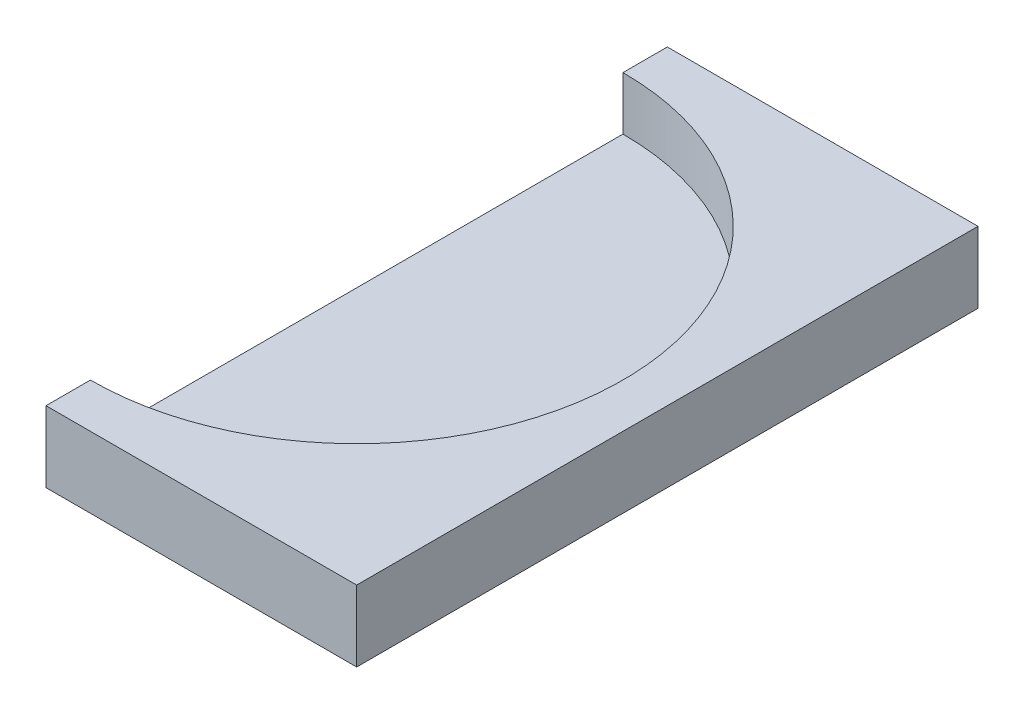
ISO-10303-21;
HEADER;
FILE_DESCRIPTION(('STEP AP214'),'2;1');
FILE_NAME('part.step','',(''),(''),'','','');
FILE_SCHEMA(('AUTOMOTIVE_DESIGN { 1 0 10303 214 1 1 1 1 }'));
ENDSEC;
DATA;
#1=APPLICATION_CONTEXT('core data for automotive mechanical design processes');
#2=APPLICATION_PROTOCOL_DEFINITION('international standard','automotive_design',2000,#1);
#3=PRODUCT_CONTEXT('',#1,'mechanical');
#4=PRODUCT('Part','Part','',(#3));
#5=PRODUCT_RELATED_PRODUCT_CATEGORY('part','',(#4));
#6=PRODUCT_DEFINITION_FORMATION('','',#4);
#7=PRODUCT_DEFINITION_CONTEXT('part definition',#1,'design');
#8=PRODUCT_DEFINITION('design','',#6,#7);
#9=PRODUCT_DEFINITION_SHAPE('','',#8);
#10=(LENGTH_UNIT() NAMED_UNIT(*) SI_UNIT(.MILLI.,.METRE.));
#11=(NAMED_UNIT(*) PLANE_ANGLE_UNIT() SI_UNIT($,.RADIAN.));
#12=(NAMED_UNIT(*) SI_UNIT($,.STERADIAN.) SOLID_ANGLE_UNIT());
#13=UNCERTAINTY_MEASURE_WITH_UNIT(LENGTH_MEASURE(1.E-05),#10,'distance_accuracy_value','');
#14=(GEOMETRIC_REPRESENTATION_CONTEXT(3) GLOBAL_UNCERTAINTY_ASSIGNED_CONTEXT((#13)) GLOBAL_UNIT_ASSIGNED_CONTEXT((#10,
#11,#12)) REPRESENTATION_CONTEXT('',''));
#15=CARTESIAN_POINT('',(0.,0.,0.));
#16=DIRECTION('',(0.,0.,1.));
#17=DIRECTION('',(1.,0.,0.));
#18=AXIS2_PLACEMENT_3D('',#15,#16,#17);
#19=CARTESIAN_POINT('',(17.5,8.,35.));
#20=DIRECTION('',(-1.,0.,0.));
#21=DIRECTION('',(0.,0.,1.));
#22=AXIS2_PLACEMENT_3D('',#19,#20,#21);
#23=PLANE('',#22);
#24=DIRECTION('',(0.,0.,-1.));
#25=VECTOR('',#24,1.);
#26=CARTESIAN_POINT('',(17.5,0.,35.));
#27=LINE('',#26,#25);
#28=CARTESIAN_POINT('',(17.5,0.,35.));
#29=VERTEX_POINT('',#28);
#30=CARTESIAN_POINT('',(17.5,0.,-35.));
#31=VERTEX_POINT('',#30);
#32=EDGE_CURVE('E122',#29,#31,#27,.T.);
#33=ORIENTED_EDGE('',*,*,#32,.T.);
#34=DIRECTION('',(0.,-1.,0.));
#35=VECTOR('',#34,1.);
#36=CARTESIAN_POINT('',(17.5,8.,-35.));
#37=LINE('',#36,#35);
#38=CARTESIAN_POINT('',(17.5,8.,-35.));
#39=VERTEX_POINT('',#38);
#40=EDGE_CURVE('E51',#39,#31,#37,.T.);
#41=ORIENTED_EDGE('',*,*,#40,.F.);
#42=DIRECTION('',(0.,0.,-1.));
#43=VECTOR('',#42,1.);
#44=CARTESIAN_POINT('',(17.5,8.,35.));
#45=LINE('',#44,#43);
#46=CARTESIAN_POINT('',(17.5,8.,35.));
#47=VERTEX_POINT('',#46);
#48=EDGE_CURVE('E126',#47,#39,#45,.T.);
#49=ORIENTED_EDGE('',*,*,#48,.F.);
#50=DIRECTION('',(0.,-1.,0.));
#51=VECTOR('',#50,1.);
#52=CARTESIAN_POINT('',(17.5,8.,35.));
#53=LINE('',#52,#51);
#54=EDGE_CURVE('E137',#47,#29,#53,.T.);
#55=ORIENTED_EDGE('',*,*,#54,.T.);
#56=EDGE_LOOP('',(#33,#41,#49,#55));
#57=FACE_BOUND('',#56,.T.);
#58=ADVANCED_FACE('F43',(#57),#23,.F.);
#59=CARTESIAN_POINT('',(-17.5,8.,-35.));
#60=DIRECTION('',(0.,0.,1.));
#61=DIRECTION('',(1.,0.,0.));
#62=AXIS2_PLACEMENT_3D('',#59,#60,#61);
#63=PLANE('',#62);
#64=DIRECTION('',(-1.,0.,0.));
#65=VECTOR('',#64,1.);
#66=CARTESIAN_POINT('',(-17.5,0.,-35.));
#67=LINE('',#66,#65);
#68=CARTESIAN_POINT('',(-17.5,0.,-35.));
#69=VERTEX_POINT('',#68);
#70=EDGE_CURVE('E141',#31,#69,#67,.T.);
#71=ORIENTED_EDGE('',*,*,#70,.T.);
#72=DIRECTION('',(0.,-1.,0.));
#73=VECTOR('',#72,1.);
#74=CARTESIAN_POINT('',(-17.5,8.,-35.));
#75=LINE('',#74,#73);
#76=CARTESIAN_POINT('',(-17.5,8.,-35.));
#77=VERTEX_POINT('',#76);
#78=EDGE_CURVE('E154',#77,#69,#75,.T.);
#79=ORIENTED_EDGE('',*,*,#78,.F.);
#80=DIRECTION('',(-1.,0.,0.));
#81=VECTOR('',#80,1.);
#82=CARTESIAN_POINT('',(-17.5,8.,-35.));
#83=LINE('',#82,#81);
#84=EDGE_CURVE('E96',#39,#77,#83,.T.);
#85=ORIENTED_EDGE('',*,*,#84,.F.);
#86=ORIENTED_EDGE('',*,*,#40,.T.);
#87=EDGE_LOOP('',(#71,#79,#85,#86));
#88=FACE_BOUND('',#87,.T.);
#89=ADVANCED_FACE('F159',(#88),#63,.F.);
#90=CARTESIAN_POINT('',(-17.5,8.,35.));
#91=DIRECTION('',(1.,0.,0.));
#92=DIRECTION('',(0.,0.,-1.));
#93=AXIS2_PLACEMENT_3D('',#90,#91,#92);
#94=PLANE('',#93);
#95=DIRECTION('',(0.,0.,1.));
#96=VECTOR('',#95,1.);
#97=CARTESIAN_POINT('',(-17.5,2.,35.));
#98=LINE('',#97,#96);
#99=CARTESIAN_POINT('',(-17.5,2.,-30.));
#100=VERTEX_POINT('',#99);
#101=CARTESIAN_POINT('',(-17.5,2.,30.));
#102=VERTEX_POINT('',#101);
#103=EDGE_CURVE('E11',#100,#102,#98,.T.);
#104=ORIENTED_EDGE('',*,*,#103,.F.);
#105=DIRECTION('',(0.,1.,0.));
#106=VECTOR('',#105,1.);
#107=CARTESIAN_POINT('',(-17.5,2.,-30.));
#108=LINE('',#107,#106);
#109=CARTESIAN_POINT('',(-17.5,8.,-30.));
#110=VERTEX_POINT('',#109);
#111=EDGE_CURVE('E111',#100,#110,#108,.T.);
#112=ORIENTED_EDGE('',*,*,#111,.T.);
#113=DIRECTION('',(0.,0.,1.));
#114=VECTOR('',#113,1.);
#115=CARTESIAN_POINT('',(-17.5,8.,35.));
#116=LINE('',#115,#114);
#117=EDGE_CURVE('E131',#77,#110,#116,.T.);
#118=ORIENTED_EDGE('',*,*,#117,.F.);
#119=ORIENTED_EDGE('',*,*,#78,.T.);
#120=DIRECTION('',(0.,0.,1.));
#121=VECTOR('',#120,1.);
#122=CARTESIAN_POINT('',(-17.5,0.,35.));
#123=LINE('',#122,#121);
#124=CARTESIAN_POINT('',(-17.5,0.,35.));
#125=VERTEX_POINT('',#124);
#126=EDGE_CURVE('E144',#69,#125,#123,.T.);
#127=ORIENTED_EDGE('',*,*,#126,.T.);
#128=DIRECTION('',(0.,-1.,0.));
#129=VECTOR('',#128,1.);
#130=CARTESIAN_POINT('',(-17.5,8.,35.));
#131=LINE('',#130,#129);
#132=CARTESIAN_POINT('',(-17.5,8.,35.));
#133=VERTEX_POINT('',#132);
#134=EDGE_CURVE('E151',#133,#125,#131,.T.);
#135=ORIENTED_EDGE('',*,*,#134,.F.);
#136=CARTESIAN_POINT('',(-17.5,8.,30.));
#137=VERTEX_POINT('',#136);
#138=EDGE_CURVE('E118',#137,#133,#116,.T.);
#139=ORIENTED_EDGE('',*,*,#138,.F.);
#140=DIRECTION('',(0.,1.,0.));
#141=VECTOR('',#140,1.);
#142=CARTESIAN_POINT('',(-17.5,2.,30.));
#143=LINE('',#142,#141);
#144=EDGE_CURVE('E58',#137,#102,#143,.F.);
#145=ORIENTED_EDGE('',*,*,#144,.T.);
#146=EDGE_LOOP('',(#104,#112,#118,#119,#127,#135,#139,#145));
#147=FACE_BOUND('',#146,.T.);
#148=ADVANCED_FACE('F116',(#147),#94,.F.);
#149=CARTESIAN_POINT('',(-17.5,8.,35.));
#150=DIRECTION('',(0.,0.,-1.));
#151=DIRECTION('',(-1.,0.,0.));
#152=AXIS2_PLACEMENT_3D('',#149,#150,#151);
#153=PLANE('',#152);
#154=DIRECTION('',(1.,0.,0.));
#155=VECTOR('',#154,1.);
#156=CARTESIAN_POINT('',(-17.5,0.,35.));
#157=LINE('',#156,#155);
#158=EDGE_CURVE('E88',#125,#29,#157,.T.);
#159=ORIENTED_EDGE('',*,*,#158,.T.);
#160=ORIENTED_EDGE('',*,*,#54,.F.);
#161=DIRECTION('',(1.,0.,0.));
#162=VECTOR('',#161,1.);
#163=CARTESIAN_POINT('',(-17.5,8.,35.));
#164=LINE('',#163,#162);
#165=EDGE_CURVE('E67',#133,#47,#164,.T.);
#166=ORIENTED_EDGE('',*,*,#165,.F.);
#167=ORIENTED_EDGE('',*,*,#134,.T.);
#168=EDGE_LOOP('',(#159,#160,#166,#167));
#169=FACE_BOUND('',#168,.T.);
#170=ADVANCED_FACE('F167',(#169),#153,.F.);
#171=CARTESIAN_POINT('',(0.,8.,0.));
#172=DIRECTION('',(0.,-1.,0.));
#173=DIRECTION('',(0.,0.,-1.));
#174=AXIS2_PLACEMENT_3D('',#171,#172,#173);
#175=PLANE('',#174);
#176=ORIENTED_EDGE('',*,*,#117,.T.);
#177=CARTESIAN_POINT('',(-17.5,8.,0.));
#178=DIRECTION('',(0.,1.,0.));
#179=DIRECTION('',(0.,0.,1.));
#180=AXIS2_PLACEMENT_3D('',#177,#178,#179);
#181=CIRCLE('',#180,30.);
#182=EDGE_CURVE('E113',#137,#110,#181,.T.);
#183=ORIENTED_EDGE('',*,*,#182,.F.);
#184=ORIENTED_EDGE('',*,*,#138,.T.);
#185=ORIENTED_EDGE('',*,*,#165,.T.);
#186=ORIENTED_EDGE('',*,*,#48,.T.);
#187=ORIENTED_EDGE('',*,*,#84,.T.);
#188=EDGE_LOOP('',(#176,#183,#184,#185,#186,#187));
#189=FACE_BOUND('',#188,.T.);
#190=ADVANCED_FACE('F168',(#189),#175,.F.);
#191=CARTESIAN_POINT('',(0.,0.,0.));
#192=DIRECTION('',(0.,-1.,0.));
#193=DIRECTION('',(0.,0.,-1.));
#194=AXIS2_PLACEMENT_3D('',#191,#192,#193);
#195=PLANE('',#194);
#196=ORIENTED_EDGE('',*,*,#32,.F.);
#197=ORIENTED_EDGE('',*,*,#158,.F.);
#198=ORIENTED_EDGE('',*,*,#126,.F.);
#199=ORIENTED_EDGE('',*,*,#70,.F.);
#200=EDGE_LOOP('',(#196,#197,#198,#199));
#201=FACE_BOUND('',#200,.T.);
#202=ADVANCED_FACE('F164',(#201),#195,.T.);
#203=CARTESIAN_POINT('',(-17.5,2.,0.));
#204=DIRECTION('',(0.,1.,0.));
#205=DIRECTION('',(0.,0.,1.));
#206=AXIS2_PLACEMENT_3D('',#203,#204,#205);
#207=PLANE('',#206);
#208=ORIENTED_EDGE('',*,*,#103,.T.);
#209=CARTESIAN_POINT('',(-17.5,2.,0.));
#210=DIRECTION('',(0.,1.,0.));
#211=DIRECTION('',(0.,0.,1.));
#212=AXIS2_PLACEMENT_3D('',#209,#210,#211);
#213=CIRCLE('',#212,30.);
#214=EDGE_CURVE('E107',#102,#100,#213,.T.);
#215=ORIENTED_EDGE('',*,*,#214,.T.);
#216=EDGE_LOOP('',(#208,#215));
#217=FACE_BOUND('',#216,.T.);
#218=ADVANCED_FACE('F106',(#217),#207,.T.);
#219=CARTESIAN_POINT('',(-17.5,2.,0.));
#220=DIRECTION('',(0.,1.,0.));
#221=DIRECTION('',(0.,0.,1.));
#222=AXIS2_PLACEMENT_3D('',#219,#220,#221);
#223=CYLINDRICAL_SURFACE('',#222,30.);
#224=ORIENTED_EDGE('',*,*,#214,.F.);
#225=ORIENTED_EDGE('',*,*,#144,.F.);
#226=ORIENTED_EDGE('',*,*,#182,.T.);
#227=ORIENTED_EDGE('',*,*,#111,.F.);
#228=EDGE_LOOP('',(#224,#225,#226,#227));
#229=FACE_BOUND('',#228,.T.);
#230=ADVANCED_FACE('F110',(#229),#223,.F.);
#231=CLOSED_SHELL('',(#58,#89,#148,#170,#190,#202,#218,#230));
#232=MANIFOLD_SOLID_BREP('B2',#231);
#233=ADVANCED_BREP_SHAPE_REPRESENTATION('',(#18,#232),#14);
#234=SHAPE_DEFINITION_REPRESENTATION(#9,#233);
ENDSEC;
END-ISO-10303-21;
